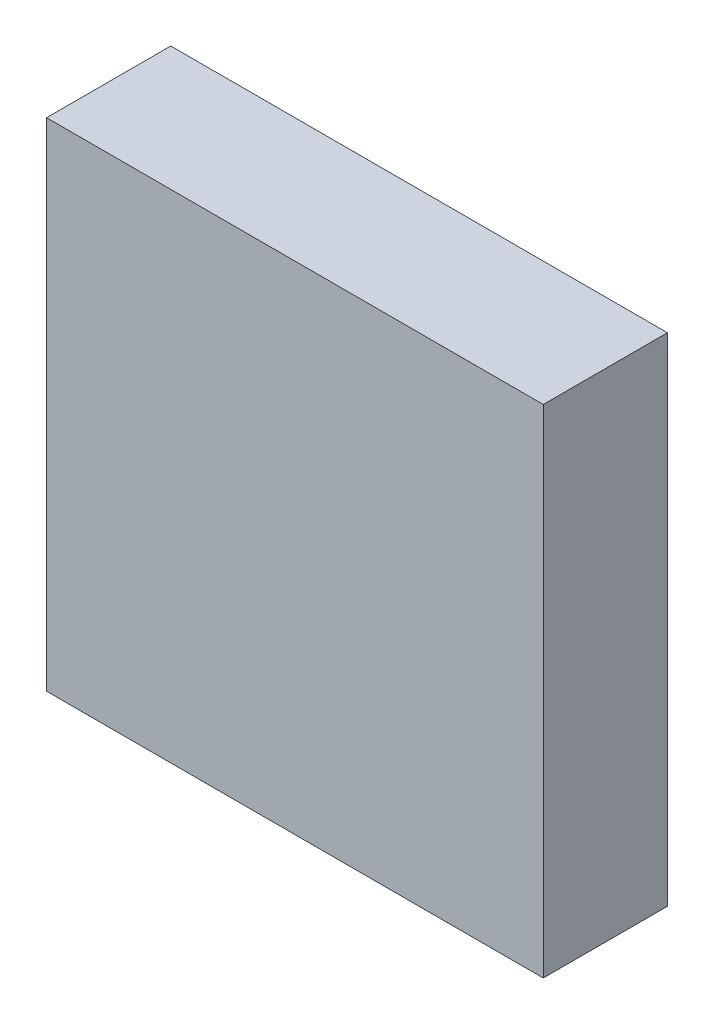
ISO-10303-21;
HEADER;
FILE_DESCRIPTION(('STEP AP214'),'2;1');
FILE_NAME('part.step','',(''),(''),'','','');
FILE_SCHEMA(('AUTOMOTIVE_DESIGN { 1 0 10303 214 1 1 1 1 }'));
ENDSEC;
DATA;
#1=APPLICATION_CONTEXT('core data for automotive mechanical design processes');
#2=APPLICATION_PROTOCOL_DEFINITION('international standard','automotive_design',2000,#1);
#3=PRODUCT_CONTEXT('',#1,'mechanical');
#4=PRODUCT('Part','Part','',(#3));
#5=PRODUCT_RELATED_PRODUCT_CATEGORY('part','',(#4));
#6=PRODUCT_DEFINITION_FORMATION('','',#4);
#7=PRODUCT_DEFINITION_CONTEXT('part definition',#1,'design');
#8=PRODUCT_DEFINITION('design','',#6,#7);
#9=PRODUCT_DEFINITION_SHAPE('','',#8);
#10=(LENGTH_UNIT() NAMED_UNIT(*) SI_UNIT(.MILLI.,.METRE.));
#11=(NAMED_UNIT(*) PLANE_ANGLE_UNIT() SI_UNIT($,.RADIAN.));
#12=(NAMED_UNIT(*) SI_UNIT($,.STERADIAN.) SOLID_ANGLE_UNIT());
#13=UNCERTAINTY_MEASURE_WITH_UNIT(LENGTH_MEASURE(1.E-05),#10,'distance_accuracy_value','');
#14=(GEOMETRIC_REPRESENTATION_CONTEXT(3) GLOBAL_UNCERTAINTY_ASSIGNED_CONTEXT((#13)) GLOBAL_UNIT_ASSIGNED_CONTEXT((#10,
#11,#12)) REPRESENTATION_CONTEXT('',''));
#15=CARTESIAN_POINT('',(0.,0.,0.));
#16=DIRECTION('',(0.,0.,1.));
#17=DIRECTION('',(1.,0.,0.));
#18=AXIS2_PLACEMENT_3D('',#15,#16,#17);
#19=CARTESIAN_POINT('',(-20000.,-20000.,-10000.));
#20=DIRECTION('',(-1.,0.,0.));
#21=DIRECTION('',(0.,0.,1.));
#22=AXIS2_PLACEMENT_3D('',#19,#20,#21);
#23=PLANE('',#22);
#24=DIRECTION('',(0.,-1.,0.));
#25=VECTOR('',#24,1.);
#26=CARTESIAN_POINT('',(-20000.,-20000.,0.));
#27=LINE('',#26,#25);
#28=CARTESIAN_POINT('',(-20000.,20000.,0.));
#29=VERTEX_POINT('',#28);
#30=CARTESIAN_POINT('',(-20000.,-20000.,0.));
#31=VERTEX_POINT('',#30);
#32=EDGE_CURVE('E104',#29,#31,#27,.T.);
#33=ORIENTED_EDGE('',*,*,#32,.F.);
#34=DIRECTION('',(0.,0.,1.));
#35=VECTOR('',#34,1.);
#36=CARTESIAN_POINT('',(-20000.,20000.,-10000.));
#37=LINE('',#36,#35);
#38=CARTESIAN_POINT('',(-20000.,20000.,-10000.));
#39=VERTEX_POINT('',#38);
#40=EDGE_CURVE('E11',#39,#29,#37,.T.);
#41=ORIENTED_EDGE('',*,*,#40,.F.);
#42=DIRECTION('',(0.,-1.,0.));
#43=VECTOR('',#42,1.);
#44=CARTESIAN_POINT('',(-20000.,-20000.,-10000.));
#45=LINE('',#44,#43);
#46=CARTESIAN_POINT('',(-20000.,-20000.,-10000.));
#47=VERTEX_POINT('',#46);
#48=EDGE_CURVE('E97',#39,#47,#45,.T.);
#49=ORIENTED_EDGE('',*,*,#48,.T.);
#50=DIRECTION('',(0.,0.,1.));
#51=VECTOR('',#50,1.);
#52=CARTESIAN_POINT('',(-20000.,-20000.,-10000.));
#53=LINE('',#52,#51);
#54=EDGE_CURVE('E42',#47,#31,#53,.T.);
#55=ORIENTED_EDGE('',*,*,#54,.T.);
#56=EDGE_LOOP('',(#33,#41,#49,#55));
#57=FACE_BOUND('',#56,.T.);
#58=ADVANCED_FACE('F41',(#57),#23,.T.);
#59=CARTESIAN_POINT('',(-20000.,20000.,-10000.));
#60=DIRECTION('',(0.,1.,0.));
#61=DIRECTION('',(0.,0.,1.));
#62=AXIS2_PLACEMENT_3D('',#59,#60,#61);
#63=PLANE('',#62);
#64=DIRECTION('',(-1.,0.,0.));
#65=VECTOR('',#64,1.);
#66=CARTESIAN_POINT('',(-20000.,20000.,0.));
#67=LINE('',#66,#65);
#68=CARTESIAN_POINT('',(20000.,20000.,0.));
#69=VERTEX_POINT('',#68);
#70=EDGE_CURVE('E101',#69,#29,#67,.T.);
#71=ORIENTED_EDGE('',*,*,#70,.F.);
#72=DIRECTION('',(0.,0.,1.));
#73=VECTOR('',#72,1.);
#74=CARTESIAN_POINT('',(20000.,20000.,-10000.));
#75=LINE('',#74,#73);
#76=CARTESIAN_POINT('',(20000.,20000.,-10000.));
#77=VERTEX_POINT('',#76);
#78=EDGE_CURVE('E49',#77,#69,#75,.T.);
#79=ORIENTED_EDGE('',*,*,#78,.F.);
#80=DIRECTION('',(-1.,0.,0.));
#81=VECTOR('',#80,1.);
#82=CARTESIAN_POINT('',(-20000.,20000.,-10000.));
#83=LINE('',#82,#81);
#84=EDGE_CURVE('E96',#77,#39,#83,.T.);
#85=ORIENTED_EDGE('',*,*,#84,.T.);
#86=ORIENTED_EDGE('',*,*,#40,.T.);
#87=EDGE_LOOP('',(#71,#79,#85,#86));
#88=FACE_BOUND('',#87,.T.);
#89=ADVANCED_FACE('F113',(#88),#63,.T.);
#90=CARTESIAN_POINT('',(20000.,-20000.,-10000.));
#91=DIRECTION('',(1.,0.,0.));
#92=DIRECTION('',(0.,0.,-1.));
#93=AXIS2_PLACEMENT_3D('',#90,#91,#92);
#94=PLANE('',#93);
#95=DIRECTION('',(0.,1.,0.));
#96=VECTOR('',#95,1.);
#97=CARTESIAN_POINT('',(20000.,-20000.,0.));
#98=LINE('',#97,#96);
#99=CARTESIAN_POINT('',(20000.,-20000.,0.));
#100=VERTEX_POINT('',#99);
#101=EDGE_CURVE('E93',#100,#69,#98,.T.);
#102=ORIENTED_EDGE('',*,*,#101,.F.);
#103=DIRECTION('',(0.,0.,1.));
#104=VECTOR('',#103,1.);
#105=CARTESIAN_POINT('',(20000.,-20000.,-10000.));
#106=LINE('',#105,#104);
#107=CARTESIAN_POINT('',(20000.,-20000.,-10000.));
#108=VERTEX_POINT('',#107);
#109=EDGE_CURVE('E88',#108,#100,#106,.T.);
#110=ORIENTED_EDGE('',*,*,#109,.F.);
#111=DIRECTION('',(0.,1.,0.));
#112=VECTOR('',#111,1.);
#113=CARTESIAN_POINT('',(20000.,-20000.,-10000.));
#114=LINE('',#113,#112);
#115=EDGE_CURVE('E90',#108,#77,#114,.T.);
#116=ORIENTED_EDGE('',*,*,#115,.T.);
#117=ORIENTED_EDGE('',*,*,#78,.T.);
#118=EDGE_LOOP('',(#102,#110,#116,#117));
#119=FACE_BOUND('',#118,.T.);
#120=ADVANCED_FACE('F86',(#119),#94,.T.);
#121=CARTESIAN_POINT('',(-20000.,-20000.,-10000.));
#122=DIRECTION('',(0.,-1.,0.));
#123=DIRECTION('',(0.,0.,-1.));
#124=AXIS2_PLACEMENT_3D('',#121,#122,#123);
#125=PLANE('',#124);
#126=DIRECTION('',(1.,0.,0.));
#127=VECTOR('',#126,1.);
#128=CARTESIAN_POINT('',(-20000.,-20000.,0.));
#129=LINE('',#128,#127);
#130=EDGE_CURVE('E107',#31,#100,#129,.T.);
#131=ORIENTED_EDGE('',*,*,#130,.F.);
#132=ORIENTED_EDGE('',*,*,#54,.F.);
#133=DIRECTION('',(1.,0.,0.));
#134=VECTOR('',#133,1.);
#135=CARTESIAN_POINT('',(-20000.,-20000.,-10000.));
#136=LINE('',#135,#134);
#137=EDGE_CURVE('E92',#47,#108,#136,.T.);
#138=ORIENTED_EDGE('',*,*,#137,.T.);
#139=ORIENTED_EDGE('',*,*,#109,.T.);
#140=EDGE_LOOP('',(#131,#132,#138,#139));
#141=FACE_BOUND('',#140,.T.);
#142=ADVANCED_FACE('F98',(#141),#125,.T.);
#143=CARTESIAN_POINT('',(0.,0.,-10000.));
#144=DIRECTION('',(0.,0.,-1.));
#145=DIRECTION('',(-1.,0.,0.));
#146=AXIS2_PLACEMENT_3D('',#143,#144,#145);
#147=PLANE('',#146);
#148=ORIENTED_EDGE('',*,*,#48,.F.);
#149=ORIENTED_EDGE('',*,*,#84,.F.);
#150=ORIENTED_EDGE('',*,*,#115,.F.);
#151=ORIENTED_EDGE('',*,*,#137,.F.);
#152=EDGE_LOOP('',(#148,#149,#150,#151));
#153=FACE_BOUND('',#152,.T.);
#154=ADVANCED_FACE('F94',(#153),#147,.T.);
#155=CARTESIAN_POINT('',(0.,0.,0.));
#156=DIRECTION('',(0.,0.,-1.));
#157=DIRECTION('',(-1.,0.,0.));
#158=AXIS2_PLACEMENT_3D('',#155,#156,#157);
#159=PLANE('',#158);
#160=ORIENTED_EDGE('',*,*,#32,.T.);
#161=ORIENTED_EDGE('',*,*,#130,.T.);
#162=ORIENTED_EDGE('',*,*,#101,.T.);
#163=ORIENTED_EDGE('',*,*,#70,.T.);
#164=EDGE_LOOP('',(#160,#161,#162,#163));
#165=FACE_BOUND('',#164,.T.);
#166=ADVANCED_FACE('F111',(#165),#159,.F.);
#167=CLOSED_SHELL('',(#58,#89,#120,#142,#154,#166));
#168=MANIFOLD_SOLID_BREP('B2',#167);
#169=ADVANCED_BREP_SHAPE_REPRESENTATION('',(#18,#168),#14);
#170=SHAPE_DEFINITION_REPRESENTATION(#9,#169);
ENDSEC;
END-ISO-10303-21;
